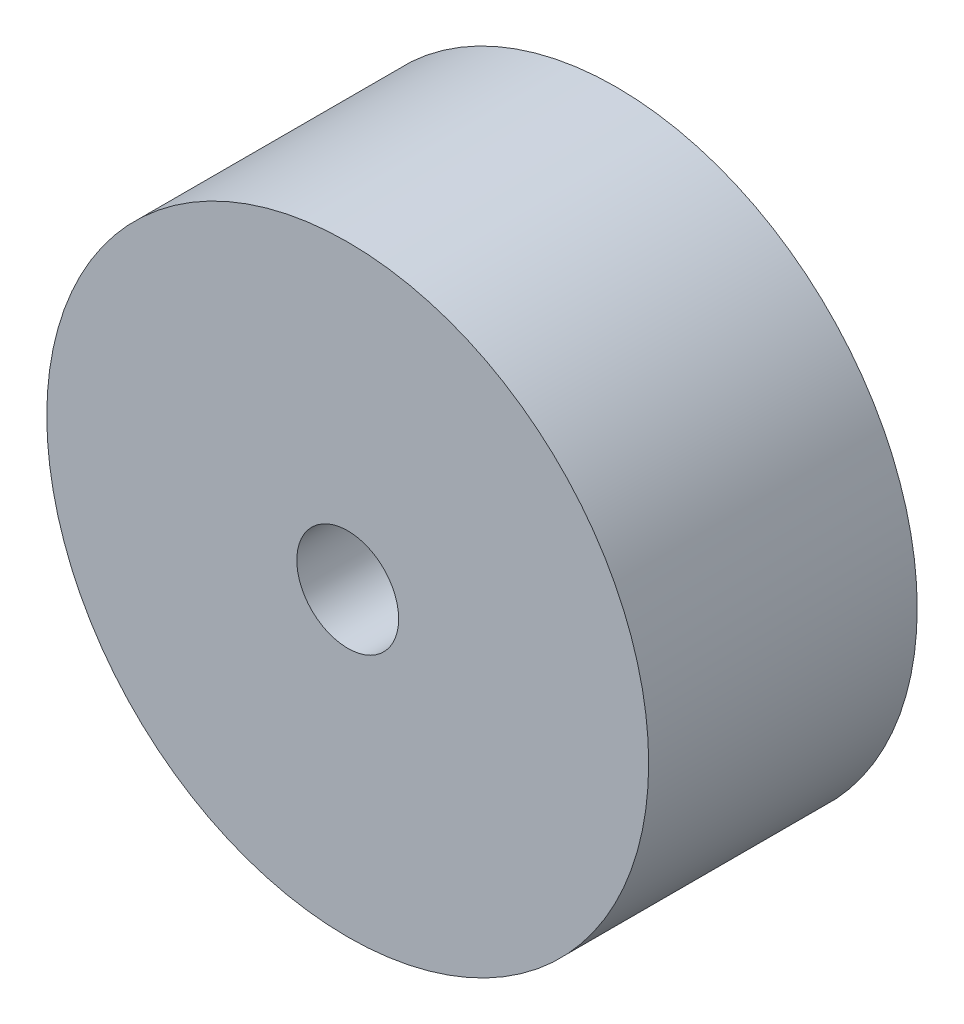
ISO-10303-21;
HEADER;
FILE_DESCRIPTION(('STEP AP214'),'2;1');
FILE_NAME('part.step','',(''),(''),'','','');
FILE_SCHEMA(('AUTOMOTIVE_DESIGN { 1 0 10303 214 1 1 1 1 }'));
ENDSEC;
DATA;
#1=APPLICATION_CONTEXT('core data for automotive mechanical design processes');
#2=APPLICATION_PROTOCOL_DEFINITION('international standard','automotive_design',2000,#1);
#3=PRODUCT_CONTEXT('',#1,'mechanical');
#4=PRODUCT('Part','Part','',(#3));
#5=PRODUCT_RELATED_PRODUCT_CATEGORY('part','',(#4));
#6=PRODUCT_DEFINITION_FORMATION('','',#4);
#7=PRODUCT_DEFINITION_CONTEXT('part definition',#1,'design');
#8=PRODUCT_DEFINITION('design','',#6,#7);
#9=PRODUCT_DEFINITION_SHAPE('','',#8);
#10=(LENGTH_UNIT() NAMED_UNIT(*) SI_UNIT(.MILLI.,.METRE.));
#11=(NAMED_UNIT(*) PLANE_ANGLE_UNIT() SI_UNIT($,.RADIAN.));
#12=(NAMED_UNIT(*) SI_UNIT($,.STERADIAN.) SOLID_ANGLE_UNIT());
#13=UNCERTAINTY_MEASURE_WITH_UNIT(LENGTH_MEASURE(1.E-05),#10,'distance_accuracy_value','');
#14=(GEOMETRIC_REPRESENTATION_CONTEXT(3) GLOBAL_UNCERTAINTY_ASSIGNED_CONTEXT((#13)) GLOBAL_UNIT_ASSIGNED_CONTEXT((#10,
#11,#12)) REPRESENTATION_CONTEXT('',''));
#15=CARTESIAN_POINT('',(0.,0.,0.));
#16=DIRECTION('',(0.,0.,1.));
#17=DIRECTION('',(1.,0.,0.));
#18=AXIS2_PLACEMENT_3D('',#15,#16,#17);
#19=CARTESIAN_POINT('',(-29.0822504710818,-1.70382614903984,5.8));
#20=DIRECTION('',(0.,0.,-1.));
#21=DIRECTION('',(-1.,0.,0.));
#22=AXIS2_PLACEMENT_3D('',#19,#20,#21);
#23=CYLINDRICAL_SURFACE('',#22,0.85);
#24=CARTESIAN_POINT('',(-29.0822504710818,-1.70382614903984,0.));
#25=DIRECTION('',(0.,0.,-1.));
#26=DIRECTION('',(-1.,0.,0.));
#27=AXIS2_PLACEMENT_3D('',#24,#25,#26);
#28=CIRCLE('',#27,0.85);
#29=CARTESIAN_POINT('',(-29.9322504710818,-1.70382614903984,0.));
#30=VERTEX_POINT('',#29);
#31=EDGE_CURVE('E63',#30,#30,#28,.T.);
#32=ORIENTED_EDGE('',*,*,#31,.T.);
#33=EDGE_LOOP('',(#32));
#34=FACE_BOUND('',#33,.T.);
#35=CARTESIAN_POINT('',(-29.0822504710818,-1.70382614903984,2.8));
#36=DIRECTION('',(0.,0.,1.));
#37=DIRECTION('',(1.,0.,0.));
#38=AXIS2_PLACEMENT_3D('',#35,#36,#37);
#39=CIRCLE('',#38,0.85);
#40=CARTESIAN_POINT('',(-28.2322504710818,-1.70382614903984,2.8));
#41=VERTEX_POINT('',#40);
#42=EDGE_CURVE('E60',#41,#41,#39,.F.);
#43=ORIENTED_EDGE('',*,*,#42,.F.);
#44=EDGE_LOOP('',(#43));
#45=FACE_BOUND('',#44,.T.);
#46=ADVANCED_FACE('F39',(#34,#45),#23,.F.);
#47=CARTESIAN_POINT('',(-29.0822504710818,-1.70382614903984,5.8));
#48=DIRECTION('',(0.,0.,-1.));
#49=DIRECTION('',(-1.,0.,0.));
#50=AXIS2_PLACEMENT_3D('',#47,#48,#49);
#51=CYLINDRICAL_SURFACE('',#50,6.5);
#52=CARTESIAN_POINT('',(-29.0822504710818,-1.70382614903984,5.8));
#53=DIRECTION('',(0.,0.,1.));
#54=DIRECTION('',(1.,0.,0.));
#55=AXIS2_PLACEMENT_3D('',#52,#53,#54);
#56=CIRCLE('',#55,6.5);
#57=CARTESIAN_POINT('',(-22.5822504710818,-1.70382614903984,5.8));
#58=VERTEX_POINT('',#57);
#59=EDGE_CURVE('E57',#58,#58,#56,.T.);
#60=ORIENTED_EDGE('',*,*,#59,.F.);
#61=EDGE_LOOP('',(#60));
#62=FACE_BOUND('',#61,.T.);
#63=CARTESIAN_POINT('',(-29.0822504710818,-1.70382614903984,0.));
#64=DIRECTION('',(0.,0.,1.));
#65=DIRECTION('',(1.,0.,0.));
#66=AXIS2_PLACEMENT_3D('',#63,#64,#65);
#67=CIRCLE('',#66,6.5);
#68=CARTESIAN_POINT('',(-22.5822504710818,-1.70382614903984,0.));
#69=VERTEX_POINT('',#68);
#70=EDGE_CURVE('E66',#69,#69,#67,.T.);
#71=ORIENTED_EDGE('',*,*,#70,.T.);
#72=EDGE_LOOP('',(#71));
#73=FACE_BOUND('',#72,.T.);
#74=ADVANCED_FACE('F105',(#62,#73),#51,.T.);
#75=CARTESIAN_POINT('',(-29.0822504710818,-1.70382614903984,5.8));
#76=DIRECTION('',(0.,0.,1.));
#77=DIRECTION('',(1.,0.,0.));
#78=AXIS2_PLACEMENT_3D('',#75,#76,#77);
#79=PLANE('',#78);
#80=CARTESIAN_POINT('',(-29.0822504710818,-1.70382614903984,5.8));
#81=DIRECTION('',(0.,0.,1.));
#82=DIRECTION('',(1.,0.,0.));
#83=AXIS2_PLACEMENT_3D('',#80,#81,#82);
#84=CIRCLE('',#83,1.1);
#85=CARTESIAN_POINT('',(-27.9822504710818,-1.70382614903984,5.8));
#86=VERTEX_POINT('',#85);
#87=EDGE_CURVE('E84',#86,#86,#84,.T.);
#88=ORIENTED_EDGE('',*,*,#87,.F.);
#89=EDGE_LOOP('',(#88));
#90=FACE_BOUND('',#89,.T.);
#91=ORIENTED_EDGE('',*,*,#59,.T.);
#92=EDGE_LOOP('',(#91));
#93=FACE_BOUND('',#92,.T.);
#94=ADVANCED_FACE('F101',(#90,#93),#79,.T.);
#95=CARTESIAN_POINT('',(-29.0822504710818,-1.70382614903984,0.));
#96=DIRECTION('',(0.,0.,1.));
#97=DIRECTION('',(1.,0.,0.));
#98=AXIS2_PLACEMENT_3D('',#95,#96,#97);
#99=PLANE('',#98);
#100=CARTESIAN_POINT('',(-29.0822504710818,-1.70382614903984,0.));
#101=DIRECTION('',(0.,0.,-1.));
#102=DIRECTION('',(-1.,0.,0.));
#103=AXIS2_PLACEMENT_3D('',#100,#101,#102);
#104=CIRCLE('',#103,4.80000000000001);
#105=CARTESIAN_POINT('',(-33.8822504710818,-1.70382614903984,0.));
#106=VERTEX_POINT('',#105);
#107=EDGE_CURVE('E74',#106,#106,#104,.T.);
#108=ORIENTED_EDGE('',*,*,#107,.F.);
#109=EDGE_LOOP('',(#108));
#110=FACE_BOUND('',#109,.T.);
#111=ORIENTED_EDGE('',*,*,#70,.F.);
#112=EDGE_LOOP('',(#111));
#113=FACE_BOUND('',#112,.T.);
#114=ADVANCED_FACE('F104',(#110,#113),#99,.F.);
#115=CARTESIAN_POINT('',(-29.0822504710818,-1.70382614903984,1.5875));
#116=DIRECTION('',(0.,0.,-1.));
#117=DIRECTION('',(-1.,0.,0.));
#118=AXIS2_PLACEMENT_3D('',#115,#116,#117);
#119=CYLINDRICAL_SURFACE('',#118,4.80000000000001);
#120=CARTESIAN_POINT('',(-29.0822504710818,-1.70382614903984,1.5875));
#121=DIRECTION('',(0.,0.,-1.));
#122=DIRECTION('',(-1.,0.,0.));
#123=AXIS2_PLACEMENT_3D('',#120,#121,#122);
#124=CIRCLE('',#123,4.80000000000001);
#125=CARTESIAN_POINT('',(-33.8822504710818,-1.70382614903984,1.5875));
#126=VERTEX_POINT('',#125);
#127=EDGE_CURVE('E70',#126,#126,#124,.T.);
#128=ORIENTED_EDGE('',*,*,#127,.F.);
#129=EDGE_LOOP('',(#128));
#130=FACE_BOUND('',#129,.T.);
#131=ORIENTED_EDGE('',*,*,#107,.T.);
#132=EDGE_LOOP('',(#131));
#133=FACE_BOUND('',#132,.T.);
#134=ADVANCED_FACE('F114',(#130,#133),#119,.F.);
#135=CARTESIAN_POINT('',(-29.0822504710818,-1.70382614903984,1.5875));
#136=DIRECTION('',(0.,0.,-1.));
#137=DIRECTION('',(-1.,0.,0.));
#138=AXIS2_PLACEMENT_3D('',#135,#136,#137);
#139=PLANE('',#138);
#140=CARTESIAN_POINT('',(-29.0822504710818,-1.70382614903984,1.5875));
#141=DIRECTION('',(0.,0.,-1.));
#142=DIRECTION('',(-1.,0.,0.));
#143=AXIS2_PLACEMENT_3D('',#140,#141,#142);
#144=CIRCLE('',#143,1.525);
#145=CARTESIAN_POINT('',(-30.6072504710818,-1.70382614903984,1.5875));
#146=VERTEX_POINT('',#145);
#147=EDGE_CURVE('E52',#146,#146,#144,.T.);
#148=ORIENTED_EDGE('',*,*,#147,.F.);
#149=EDGE_LOOP('',(#148));
#150=FACE_BOUND('',#149,.T.);
#151=ORIENTED_EDGE('',*,*,#127,.T.);
#152=EDGE_LOOP('',(#151));
#153=FACE_BOUND('',#152,.T.);
#154=ADVANCED_FACE('F120',(#150,#153),#139,.T.);
#155=CARTESIAN_POINT('',(-29.0822504710818,-1.70382614903984,3.));
#156=DIRECTION('',(0.,0.,-1.));
#157=DIRECTION('',(-1.,0.,0.));
#158=AXIS2_PLACEMENT_3D('',#155,#156,#157);
#159=CYLINDRICAL_SURFACE('',#158,1.525);
#160=CARTESIAN_POINT('',(-29.0822504710818,-1.70382614903984,0.2));
#161=DIRECTION('',(0.,0.,-1.));
#162=DIRECTION('',(-1.,0.,0.));
#163=AXIS2_PLACEMENT_3D('',#160,#161,#162);
#164=CIRCLE('',#163,1.525);
#165=CARTESIAN_POINT('',(-30.6072504710818,-1.70382614903984,0.2));
#166=VERTEX_POINT('',#165);
#167=EDGE_CURVE('E10',#166,#166,#164,.F.);
#168=ORIENTED_EDGE('',*,*,#167,.T.);
#169=EDGE_LOOP('',(#168));
#170=FACE_BOUND('',#169,.T.);
#171=ORIENTED_EDGE('',*,*,#147,.T.);
#172=EDGE_LOOP('',(#171));
#173=FACE_BOUND('',#172,.T.);
#174=ADVANCED_FACE('F132',(#170,#173),#159,.T.);
#175=CARTESIAN_POINT('',(-29.0822504710818,-1.70382614903984,0.));
#176=DIRECTION('',(0.,0.,-1.));
#177=DIRECTION('',(-1.,0.,0.));
#178=AXIS2_PLACEMENT_3D('',#175,#176,#177);
#179=PLANE('',#178);
#180=CARTESIAN_POINT('',(-29.0822504710818,-1.70382614903984,0.));
#181=DIRECTION('',(0.,0.,-1.));
#182=DIRECTION('',(-1.,0.,0.));
#183=AXIS2_PLACEMENT_3D('',#180,#181,#182);
#184=CIRCLE('',#183,1.325);
#185=CARTESIAN_POINT('',(-30.4072504710818,-1.70382614903984,0.));
#186=VERTEX_POINT('',#185);
#187=EDGE_CURVE('E47',#186,#186,#184,.T.);
#188=ORIENTED_EDGE('',*,*,#187,.T.);
#189=EDGE_LOOP('',(#188));
#190=FACE_BOUND('',#189,.T.);
#191=ORIENTED_EDGE('',*,*,#31,.F.);
#192=EDGE_LOOP('',(#191));
#193=FACE_BOUND('',#192,.T.);
#194=ADVANCED_FACE('F135',(#190,#193),#179,.T.);
#195=CARTESIAN_POINT('',(-29.0822504710818,-1.70382614903984,2.8));
#196=DIRECTION('',(0.,0.,1.));
#197=DIRECTION('',(1.,0.,0.));
#198=AXIS2_PLACEMENT_3D('',#195,#196,#197);
#199=PLANE('',#198);
#200=CARTESIAN_POINT('',(-29.0822504710818,-1.70382614903984,2.8));
#201=DIRECTION('',(0.,0.,1.));
#202=DIRECTION('',(1.,0.,0.));
#203=AXIS2_PLACEMENT_3D('',#200,#201,#202);
#204=CIRCLE('',#203,1.1);
#205=CARTESIAN_POINT('',(-27.9822504710818,-1.70382614903984,2.8));
#206=VERTEX_POINT('',#205);
#207=EDGE_CURVE('E64',#206,#206,#204,.T.);
#208=ORIENTED_EDGE('',*,*,#207,.T.);
#209=EDGE_LOOP('',(#208));
#210=FACE_BOUND('',#209,.T.);
#211=ORIENTED_EDGE('',*,*,#42,.T.);
#212=EDGE_LOOP('',(#211));
#213=FACE_BOUND('',#212,.T.);
#214=ADVANCED_FACE('F92',(#210,#213),#199,.T.);
#215=CARTESIAN_POINT('',(-29.0822504710818,-1.70382614903984,2.8));
#216=DIRECTION('',(0.,0.,1.));
#217=DIRECTION('',(1.,0.,0.));
#218=AXIS2_PLACEMENT_3D('',#215,#216,#217);
#219=CYLINDRICAL_SURFACE('',#218,1.1);
#220=ORIENTED_EDGE('',*,*,#207,.F.);
#221=EDGE_LOOP('',(#220));
#222=FACE_BOUND('',#221,.T.);
#223=ORIENTED_EDGE('',*,*,#87,.T.);
#224=EDGE_LOOP('',(#223));
#225=FACE_BOUND('',#224,.T.);
#226=ADVANCED_FACE('F95',(#222,#225),#219,.F.);
#227=CARTESIAN_POINT('',(-29.0822504710818,-1.70382614903984,0.2));
#228=DIRECTION('',(0.,0.,-1.));
#229=DIRECTION('',(-1.,0.,0.));
#230=AXIS2_PLACEMENT_3D('',#227,#228,#229);
#231=TOROIDAL_SURFACE('',#230,1.325,0.2);
#232=ORIENTED_EDGE('',*,*,#167,.F.);
#233=EDGE_LOOP('',(#232));
#234=FACE_BOUND('',#233,.T.);
#235=ORIENTED_EDGE('',*,*,#187,.F.);
#236=EDGE_LOOP('',(#235));
#237=FACE_BOUND('',#236,.T.);
#238=ADVANCED_FACE('F41',(#234,#237),#231,.T.);
#239=CLOSED_SHELL('',(#46,#74,#94,#114,#134,#154,#174,#194,#214,#226,#238));
#240=MANIFOLD_SOLID_BREP('B2',#239);
#241=ADVANCED_BREP_SHAPE_REPRESENTATION('',(#18,#240),#14);
#242=SHAPE_DEFINITION_REPRESENTATION(#9,#241);
ENDSEC;
END-ISO-10303-21;
